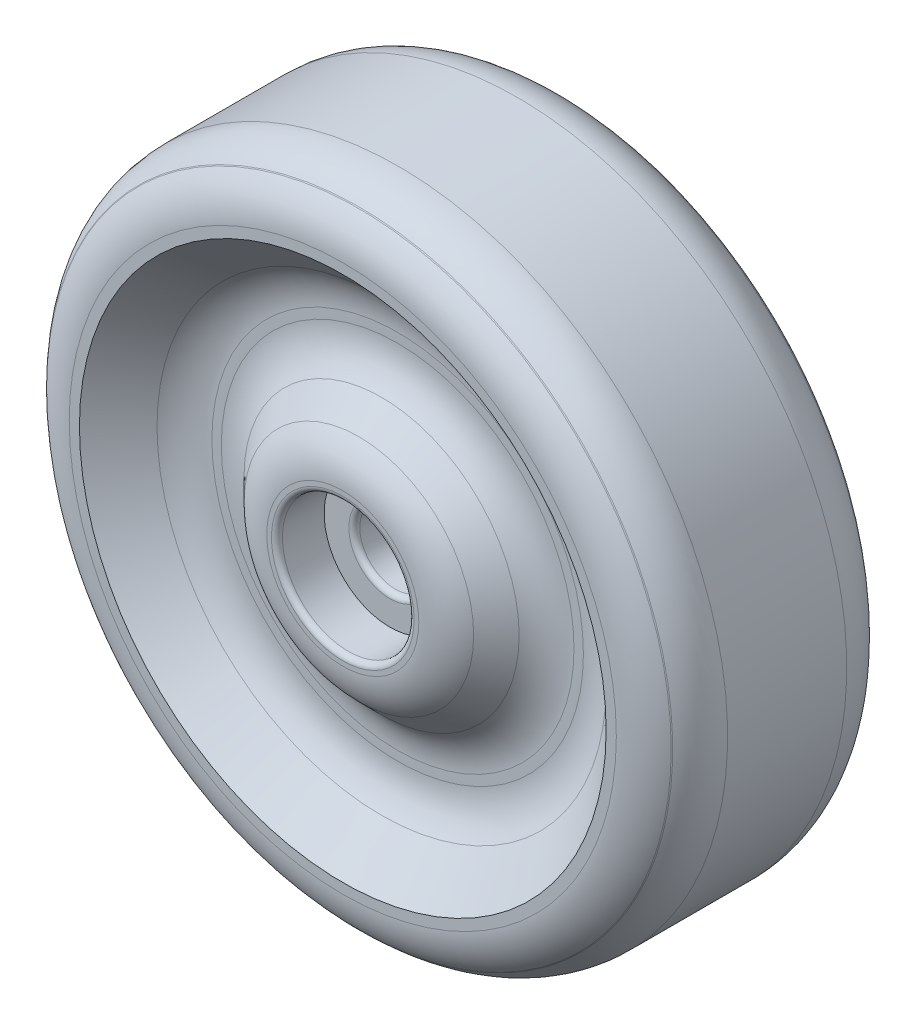
ISO-10303-21;
HEADER;
FILE_DESCRIPTION(('STEP AP214'),'2;1');
FILE_NAME('part.step','',(''),(''),'','','');
FILE_SCHEMA(('AUTOMOTIVE_DESIGN { 1 0 10303 214 1 1 1 1 }'));
ENDSEC;
DATA;
#1=APPLICATION_CONTEXT('core data for automotive mechanical design processes');
#2=APPLICATION_PROTOCOL_DEFINITION('international standard','automotive_design',2000,#1);
#3=PRODUCT_CONTEXT('',#1,'mechanical');
#4=PRODUCT('Part','Part','',(#3));
#5=PRODUCT_RELATED_PRODUCT_CATEGORY('part','',(#4));
#6=PRODUCT_DEFINITION_FORMATION('','',#4);
#7=PRODUCT_DEFINITION_CONTEXT('part definition',#1,'design');
#8=PRODUCT_DEFINITION('design','',#6,#7);
#9=PRODUCT_DEFINITION_SHAPE('','',#8);
#10=(LENGTH_UNIT() NAMED_UNIT(*) SI_UNIT(.MILLI.,.METRE.));
#11=(NAMED_UNIT(*) PLANE_ANGLE_UNIT() SI_UNIT($,.RADIAN.));
#12=(NAMED_UNIT(*) SI_UNIT($,.STERADIAN.) SOLID_ANGLE_UNIT());
#13=UNCERTAINTY_MEASURE_WITH_UNIT(LENGTH_MEASURE(1.E-05),#10,'distance_accuracy_value','');
#14=(GEOMETRIC_REPRESENTATION_CONTEXT(3) GLOBAL_UNCERTAINTY_ASSIGNED_CONTEXT((#13)) GLOBAL_UNIT_ASSIGNED_CONTEXT((#10,
#11,#12)) REPRESENTATION_CONTEXT('',''));
#15=CARTESIAN_POINT('',(0.,0.,0.));
#16=DIRECTION('',(0.,0.,1.));
#17=DIRECTION('',(1.,0.,0.));
#18=AXIS2_PLACEMENT_3D('',#15,#16,#17);
#19=CARTESIAN_POINT('',(0.,0.,-10.5));
#20=DIRECTION('',(0.,0.,1.));
#21=DIRECTION('',(1.,0.,0.));
#22=AXIS2_PLACEMENT_3D('',#19,#20,#21);
#23=PLANE('',#22);
#24=CARTESIAN_POINT('',(0.,0.,-10.5));
#25=DIRECTION('',(0.,0.,1.));
#26=DIRECTION('',(1.,0.,0.));
#27=AXIS2_PLACEMENT_3D('',#24,#25,#26);
#28=CIRCLE('',#27,6.92893218813451);
#29=CARTESIAN_POINT('',(6.92893218813451,0.,-10.5));
#30=VERTEX_POINT('',#29);
#31=EDGE_CURVE('E70',#30,#30,#28,.F.);
#32=ORIENTED_EDGE('',*,*,#31,.T.);
#33=EDGE_LOOP('',(#32));
#34=FACE_BOUND('',#33,.T.);
#35=CARTESIAN_POINT('',(0.,0.,-10.5));
#36=DIRECTION('',(0.,0.,1.));
#37=DIRECTION('',(1.,0.,0.));
#38=AXIS2_PLACEMENT_3D('',#35,#36,#37);
#39=CIRCLE('',#38,6.5);
#40=CARTESIAN_POINT('',(6.5,0.,-10.5));
#41=VERTEX_POINT('',#40);
#42=EDGE_CURVE('E97',#41,#41,#39,.T.);
#43=ORIENTED_EDGE('',*,*,#42,.T.);
#44=EDGE_LOOP('',(#43));
#45=FACE_BOUND('',#44,.T.);
#46=ADVANCED_FACE('F38',(#34,#45),#23,.F.);
#47=CARTESIAN_POINT('',(0.,0.,10.5));
#48=DIRECTION('',(0.,0.,1.));
#49=DIRECTION('',(1.,0.,0.));
#50=AXIS2_PLACEMENT_3D('',#47,#48,#49);
#51=PLANE('',#50);
#52=CARTESIAN_POINT('',(0.,0.,10.5));
#53=DIRECTION('',(0.,0.,1.));
#54=DIRECTION('',(1.,0.,0.));
#55=AXIS2_PLACEMENT_3D('',#52,#53,#54);
#56=CIRCLE('',#55,6.92893218813453);
#57=CARTESIAN_POINT('',(6.92893218813453,0.,10.5));
#58=VERTEX_POINT('',#57);
#59=EDGE_CURVE('E49',#58,#58,#56,.T.);
#60=ORIENTED_EDGE('',*,*,#59,.T.);
#61=EDGE_LOOP('',(#60));
#62=FACE_BOUND('',#61,.T.);
#63=CARTESIAN_POINT('',(0.,0.,10.5));
#64=DIRECTION('',(0.,0.,1.));
#65=DIRECTION('',(1.,0.,0.));
#66=AXIS2_PLACEMENT_3D('',#63,#64,#65);
#67=CIRCLE('',#66,6.5);
#68=CARTESIAN_POINT('',(6.5,0.,10.5));
#69=VERTEX_POINT('',#68);
#70=EDGE_CURVE('E85',#69,#69,#67,.F.);
#71=ORIENTED_EDGE('',*,*,#70,.T.);
#72=EDGE_LOOP('',(#71));
#73=FACE_BOUND('',#72,.T.);
#74=ADVANCED_FACE('F151',(#62,#73),#51,.T.);
#75=CARTESIAN_POINT('',(0.,0.,-10.5));
#76=DIRECTION('',(0.,0.,1.));
#77=DIRECTION('',(1.,0.,0.));
#78=AXIS2_PLACEMENT_3D('',#75,#76,#77);
#79=CYLINDRICAL_SURFACE('',#78,3.25);
#80=CARTESIAN_POINT('',(0.,0.,-5.7));
#81=DIRECTION('',(0.,0.,-1.));
#82=DIRECTION('',(-1.,0.,0.));
#83=AXIS2_PLACEMENT_3D('',#80,#81,#82);
#84=CIRCLE('',#83,3.25);
#85=CARTESIAN_POINT('',(3.25,0.,-5.7));
#86=VERTEX_POINT('',#85);
#87=EDGE_CURVE('E100',#86,#86,#84,.T.);
#88=CARTESIAN_POINT('',(0.,0.,5.7));
#89=DIRECTION('',(0.,0.,1.));
#90=DIRECTION('',(1.,0.,0.));
#91=AXIS2_PLACEMENT_3D('',#88,#89,#90);
#92=CIRCLE('',#91,3.25);
#93=CARTESIAN_POINT('',(3.25,0.,5.69999999999999));
#94=VERTEX_POINT('',#93);
#95=EDGE_CURVE('E103',#94,#94,#92,.T.);
#96=CARTESIAN_POINT('',(3.25,0.,-5.7));
#97=CARTESIAN_POINT('',(3.25,0.,-5.58125));
#98=CARTESIAN_POINT('',(3.25,0.,-5.4625));
#99=CARTESIAN_POINT('',(3.25,0.,-5.225));
#100=CARTESIAN_POINT('',(3.25,0.,-5.10625));
#101=CARTESIAN_POINT('',(3.25,0.,-4.86875));
#102=CARTESIAN_POINT('',(3.25,0.,-4.75));
#103=CARTESIAN_POINT('',(3.25,0.,-4.5125));
#104=CARTESIAN_POINT('',(3.25,0.,-4.39375));
#105=CARTESIAN_POINT('',(3.25,0.,-4.15625));
#106=CARTESIAN_POINT('',(3.25,0.,-4.0375));
#107=CARTESIAN_POINT('',(3.25,0.,-3.8));
#108=CARTESIAN_POINT('',(3.25,0.,-3.68125));
#109=CARTESIAN_POINT('',(3.25,0.,-3.44375));
#110=CARTESIAN_POINT('',(3.25,0.,-3.325));
#111=CARTESIAN_POINT('',(3.25,0.,-3.0875));
#112=CARTESIAN_POINT('',(3.25,0.,-2.96875));
#113=CARTESIAN_POINT('',(3.25,0.,-2.73125));
#114=CARTESIAN_POINT('',(3.25,0.,-2.6125));
#115=CARTESIAN_POINT('',(3.25,0.,-2.375));
#116=CARTESIAN_POINT('',(3.25,0.,-2.25625));
#117=CARTESIAN_POINT('',(3.25,0.,-2.01875));
#118=CARTESIAN_POINT('',(3.25,0.,-1.9));
#119=CARTESIAN_POINT('',(3.25,0.,-1.6625));
#120=CARTESIAN_POINT('',(3.25,0.,-1.54375));
#121=CARTESIAN_POINT('',(3.25,0.,-1.30625));
#122=CARTESIAN_POINT('',(3.25,0.,-1.1875));
#123=CARTESIAN_POINT('',(3.25,0.,-0.950000000000001));
#124=CARTESIAN_POINT('',(3.25,0.,-0.831250000000001));
#125=CARTESIAN_POINT('',(3.25,0.,-0.593750000000002));
#126=CARTESIAN_POINT('',(3.25,0.,-0.475000000000002));
#127=CARTESIAN_POINT('',(3.25,0.,-0.237500000000002));
#128=CARTESIAN_POINT('',(3.25,0.,-0.118750000000002));
#129=CARTESIAN_POINT('',(3.25,0.,0.118749999999998));
#130=CARTESIAN_POINT('',(3.25,0.,0.237499999999999));
#131=CARTESIAN_POINT('',(3.25,0.,0.474999999999999));
#132=CARTESIAN_POINT('',(3.25,0.,0.593749999999998));
#133=CARTESIAN_POINT('',(3.25,0.,0.831249999999997));
#134=CARTESIAN_POINT('',(3.25,0.,0.949999999999997));
#135=CARTESIAN_POINT('',(3.25,0.,1.1875));
#136=CARTESIAN_POINT('',(3.25,0.,1.30625));
#137=CARTESIAN_POINT('',(3.25,0.,1.54375));
#138=CARTESIAN_POINT('',(3.25,0.,1.6625));
#139=CARTESIAN_POINT('',(3.25,0.,1.9));
#140=CARTESIAN_POINT('',(3.25,0.,2.01875));
#141=CARTESIAN_POINT('',(3.25,0.,2.25625));
#142=CARTESIAN_POINT('',(3.25,0.,2.375));
#143=CARTESIAN_POINT('',(3.25,0.,2.6125));
#144=CARTESIAN_POINT('',(3.25,0.,2.73125));
#145=CARTESIAN_POINT('',(3.25,0.,2.96875));
#146=CARTESIAN_POINT('',(3.25,0.,3.0875));
#147=CARTESIAN_POINT('',(3.25,0.,3.325));
#148=CARTESIAN_POINT('',(3.25,0.,3.44375));
#149=CARTESIAN_POINT('',(3.25,0.,3.68125));
#150=CARTESIAN_POINT('',(3.25,0.,3.8));
#151=CARTESIAN_POINT('',(3.25,0.,4.0375));
#152=CARTESIAN_POINT('',(3.25,0.,4.15625));
#153=CARTESIAN_POINT('',(3.25,0.,4.39375));
#154=CARTESIAN_POINT('',(3.25,0.,4.5125));
#155=CARTESIAN_POINT('',(3.25,0.,4.75));
#156=CARTESIAN_POINT('',(3.25,0.,4.86875));
#157=CARTESIAN_POINT('',(3.25,0.,5.10625));
#158=CARTESIAN_POINT('',(3.25,0.,5.22499999999999));
#159=CARTESIAN_POINT('',(3.25,0.,5.46249999999999));
#160=CARTESIAN_POINT('',(3.25,0.,5.58124999999999));
#161=CARTESIAN_POINT('',(3.25,0.,5.69999999999999));
#162=B_SPLINE_CURVE_WITH_KNOTS('',3,(#96,#97,#98,#99,#100,#101,#102,#103,#104,#105,#106,#107,
#108,#109,#110,#111,#112,#113,#114,#115,#116,#117,#118,#119,#120,#121,#122,#123,#124,#125,#126,
#127,#128,#129,#130,#131,#132,#133,#134,#135,#136,#137,#138,#139,#140,#141,#142,#143,#144,#145,
#146,#147,#148,#149,#150,#151,#152,#153,#154,#155,#156,#157,#158,#159,#160,#161),.UNSPECIFIED.,
.F.,.F.,(4,2,2,2,2,2,2,2,2,2,2,2,2,2,2,2,2,2,2,2,2,2,2,2,2,2,2,2,2,2,2,2,4),(0.,0.35625,0.7125,
1.06875,1.425,1.78125,2.1375,2.49375,2.85,3.20625,3.5625,3.91875,4.275,4.63125,4.9875,5.34375,
5.7,6.05625,6.4125,6.76875,7.125,7.48125,7.8375,8.19375,8.55,8.90625,9.2625,9.61875,9.975,
10.33125,10.6875,11.04375,11.4),.UNSPECIFIED.);
#163=EDGE_CURVE('BSEAM177',#86,#94,#162,.T.);
#164=ORIENTED_EDGE('',*,*,#87,.T.);
#165=ORIENTED_EDGE('',*,*,#95,.T.);
#166=ORIENTED_EDGE('',*,*,#163,.T.);
#167=ORIENTED_EDGE('',*,*,#163,.F.);
#168=EDGE_LOOP('',(#164,#166,#165,#167));
#169=FACE_BOUND('',#168,.T.);
#170=ADVANCED_FACE('F177',(#169),#79,.F.);
#171=CARTESIAN_POINT('',(0.,0.,10.5));
#172=DIRECTION('',(0.,0.,-1.));
#173=DIRECTION('',(-1.,0.,0.));
#174=AXIS2_PLACEMENT_3D('',#171,#172,#173);
#175=CYLINDRICAL_SURFACE('',#174,30.);
#176=CARTESIAN_POINT('',(0.,0.,-5.42893218813449));
#177=DIRECTION('',(0.,0.,-1.));
#178=DIRECTION('',(-1.,0.,0.));
#179=AXIS2_PLACEMENT_3D('',#176,#177,#178);
#180=CIRCLE('',#179,30.);
#181=CARTESIAN_POINT('',(-30.,0.,-5.42893218813448));
#182=VERTEX_POINT('',#181);
#183=EDGE_CURVE('E118',#182,#182,#180,.F.);
#184=CARTESIAN_POINT('',(0.,0.,5.42893218813456));
#185=DIRECTION('',(0.,0.,1.));
#186=DIRECTION('',(1.,0.,0.));
#187=AXIS2_PLACEMENT_3D('',#184,#185,#186);
#188=CIRCLE('',#187,30.);
#189=CARTESIAN_POINT('',(-30.,0.,5.42893218813456));
#190=VERTEX_POINT('',#189);
#191=EDGE_CURVE('E121',#190,#190,#188,.F.);
#192=CARTESIAN_POINT('',(-30.,0.,-5.42893218813448));
#193=CARTESIAN_POINT('',(-30.,0.,-5.31582943421501));
#194=CARTESIAN_POINT('',(-30.,0.,-5.20272668029555));
#195=CARTESIAN_POINT('',(-30.,0.,-4.97652117245661));
#196=CARTESIAN_POINT('',(-30.,0.,-4.86341841853714));
#197=CARTESIAN_POINT('',(-30.,0.,-4.6372129106982));
#198=CARTESIAN_POINT('',(-30.,0.,-4.52411015677873));
#199=CARTESIAN_POINT('',(-30.,0.,-4.29790464893979));
#200=CARTESIAN_POINT('',(-30.,0.,-4.18480189502032));
#201=CARTESIAN_POINT('',(-30.,0.,-3.95859638718139));
#202=CARTESIAN_POINT('',(-30.,0.,-3.84549363326192));
#203=CARTESIAN_POINT('',(-30.,0.,-3.61928812542298));
#204=CARTESIAN_POINT('',(-30.,0.,-3.50618537150351));
#205=CARTESIAN_POINT('',(-30.,0.,-3.27997986366457));
#206=CARTESIAN_POINT('',(-30.,0.,-3.1668771097451));
#207=CARTESIAN_POINT('',(-30.,0.,-2.94067160190616));
#208=CARTESIAN_POINT('',(-30.,0.,-2.82756884798669));
#209=CARTESIAN_POINT('',(-30.,0.,-2.60136334014775));
#210=CARTESIAN_POINT('',(-30.,0.,-2.48826058622828));
#211=CARTESIAN_POINT('',(-30.,0.,-2.26205507838935));
#212=CARTESIAN_POINT('',(-30.,0.,-2.14895232446988));
#213=CARTESIAN_POINT('',(-30.,0.,-1.92274681663094));
#214=CARTESIAN_POINT('',(-30.,0.,-1.80964406271147));
#215=CARTESIAN_POINT('',(-30.,0.,-1.58343855487253));
#216=CARTESIAN_POINT('',(-30.,0.,-1.47033580095306));
#217=CARTESIAN_POINT('',(-30.,0.,-1.24413029311412));
#218=CARTESIAN_POINT('',(-30.,0.,-1.13102753919465));
#219=CARTESIAN_POINT('',(-30.,0.,-0.904822031355716));
#220=CARTESIAN_POINT('',(-30.,0.,-0.791719277436246));
#221=CARTESIAN_POINT('',(-30.,0.,-0.565513769597307));
#222=CARTESIAN_POINT('',(-30.,0.,-0.452411015677838));
#223=CARTESIAN_POINT('',(-30.,0.,-0.2262055078389));
#224=CARTESIAN_POINT('',(-30.,0.,-0.113102753919431));
#225=CARTESIAN_POINT('',(-30.,0.,0.113102753919507));
#226=CARTESIAN_POINT('',(-30.,0.,0.226205507838976));
#227=CARTESIAN_POINT('',(-30.,0.,0.452411015677914));
#228=CARTESIAN_POINT('',(-30.,0.,0.565513769597384));
#229=CARTESIAN_POINT('',(-30.,0.,0.791719277436323));
#230=CARTESIAN_POINT('',(-30.,0.,0.904822031355792));
#231=CARTESIAN_POINT('',(-30.,0.,1.13102753919473));
#232=CARTESIAN_POINT('',(-30.,0.,1.2441302931142));
#233=CARTESIAN_POINT('',(-30.,0.,1.47033580095314));
#234=CARTESIAN_POINT('',(-30.,0.,1.58343855487261));
#235=CARTESIAN_POINT('',(-30.,0.,1.80964406271155));
#236=CARTESIAN_POINT('',(-30.,0.,1.92274681663102));
#237=CARTESIAN_POINT('',(-30.,0.,2.14895232446995));
#238=CARTESIAN_POINT('',(-30.,0.,2.26205507838942));
#239=CARTESIAN_POINT('',(-30.,0.,2.48826058622836));
#240=CARTESIAN_POINT('',(-30.,0.,2.60136334014783));
#241=CARTESIAN_POINT('',(-30.,0.,2.82756884798677));
#242=CARTESIAN_POINT('',(-30.,0.,2.94067160190624));
#243=CARTESIAN_POINT('',(-30.,0.,3.16687710974518));
#244=CARTESIAN_POINT('',(-30.,0.,3.27997986366464));
#245=CARTESIAN_POINT('',(-30.,0.,3.50618537150358));
#246=CARTESIAN_POINT('',(-30.,0.,3.61928812542305));
#247=CARTESIAN_POINT('',(-30.,0.,3.84549363326199));
#248=CARTESIAN_POINT('',(-30.,0.,3.95859638718146));
#249=CARTESIAN_POINT('',(-30.,0.,4.1848018950204));
#250=CARTESIAN_POINT('',(-30.,0.,4.29790464893987));
#251=CARTESIAN_POINT('',(-30.,0.,4.52411015677881));
#252=CARTESIAN_POINT('',(-30.,0.,4.63721291069828));
#253=CARTESIAN_POINT('',(-30.,0.,4.86341841853721));
#254=CARTESIAN_POINT('',(-30.,0.,4.97652117245668));
#255=CARTESIAN_POINT('',(-30.,0.,5.20272668029562));
#256=CARTESIAN_POINT('',(-30.,0.,5.31582943421509));
#257=CARTESIAN_POINT('',(-30.,0.,5.42893218813456));
#258=B_SPLINE_CURVE_WITH_KNOTS('',3,(#192,#193,#194,#195,#196,#197,#198,#199,#200,#201,#202,
#203,#204,#205,#206,#207,#208,#209,#210,#211,#212,#213,#214,#215,#216,#217,#218,#219,#220,#221,
#222,#223,#224,#225,#226,#227,#228,#229,#230,#231,#232,#233,#234,#235,#236,#237,#238,#239,#240,
#241,#242,#243,#244,#245,#246,#247,#248,#249,#250,#251,#252,#253,#254,#255,#256,#257),
.UNSPECIFIED.,.F.,.F.,(4,2,2,2,2,2,2,2,2,2,2,2,2,2,2,2,2,2,2,2,2,2,2,2,2,2,2,2,2,2,2,2,4),(0.,
0.339308261758407,0.678616523516813,1.01792478527522,1.35723304703363,1.69654130879204,
2.03584957055044,2.37515783230885,2.71446609406726,3.05377435582567,3.39308261758407,
3.73239087934248,4.07169914110089,4.4110074028593,4.75031566461771,5.08962392637611,
5.42893218813452,5.76824044989293,6.10754871165134,6.44685697340974,6.78616523516815,
7.12547349692656,7.46478175868497,7.80409002044337,8.14339828220178,8.48270654396019,
8.8220148057186,9.161323067477,9.50063132923541,9.83993959099382,10.1792478527522,
10.5185561145106,10.857864376269),.UNSPECIFIED.);
#259=EDGE_CURVE('BSEAM149',#182,#190,#258,.T.);
#260=ORIENTED_EDGE('',*,*,#183,.T.);
#261=ORIENTED_EDGE('',*,*,#191,.T.);
#262=ORIENTED_EDGE('',*,*,#259,.T.);
#263=ORIENTED_EDGE('',*,*,#259,.F.);
#264=EDGE_LOOP('',(#260,#262,#261,#263));
#265=FACE_BOUND('',#264,.T.);
#266=ADVANCED_FACE('F149',(#265),#175,.T.);
#267=CARTESIAN_POINT('',(0.,0.,10.5));
#268=DIRECTION('',(0.,0.,1.));
#269=DIRECTION('',(1.,0.,0.));
#270=AXIS2_PLACEMENT_3D('',#267,#268,#269);
#271=CIRCLE('',#270,24.);
#272=CARTESIAN_POINT('',(24.,0.,10.5));
#273=VERTEX_POINT('',#272);
#274=EDGE_CURVE('E139',#273,#273,#271,.T.);
#275=ORIENTED_EDGE('',*,*,#274,.F.);
#276=EDGE_LOOP('',(#275));
#277=FACE_BOUND('',#276,.T.);
#278=CARTESIAN_POINT('',(0.,0.,10.5));
#279=DIRECTION('',(0.,0.,1.));
#280=DIRECTION('',(1.,0.,0.));
#281=AXIS2_PLACEMENT_3D('',#278,#279,#280);
#282=CIRCLE('',#281,24.9289321881346);
#283=CARTESIAN_POINT('',(24.9289321881346,0.,10.5));
#284=VERTEX_POINT('',#283);
#285=EDGE_CURVE('E115',#284,#284,#282,.T.);
#286=ORIENTED_EDGE('',*,*,#285,.T.);
#287=EDGE_LOOP('',(#286));
#288=FACE_BOUND('',#287,.T.);
#289=ADVANCED_FACE('F145',(#277,#288),#51,.T.);
#290=CARTESIAN_POINT('',(0.,0.,-7.49999999999997));
#291=DIRECTION('',(0.,0.,1.));
#292=DIRECTION('',(1.,0.,0.));
#293=AXIS2_PLACEMENT_3D('',#290,#291,#292);
#294=CONICAL_SURFACE('',#293,30.,0.785398163397452);
#295=CARTESIAN_POINT('',(0.,0.,-9.03553390593275));
#296=DIRECTION('',(0.,0.,1.));
#297=DIRECTION('',(1.,0.,0.));
#298=AXIS2_PLACEMENT_3D('',#295,#296,#297);
#299=CIRCLE('',#298,28.4644660940672);
#300=CARTESIAN_POINT('',(28.4644660940672,0.,-9.03553390593275));
#301=VERTEX_POINT('',#300);
#302=EDGE_CURVE('E124',#301,#301,#299,.T.);
#303=ORIENTED_EDGE('',*,*,#302,.T.);
#304=EDGE_LOOP('',(#303));
#305=FACE_BOUND('',#304,.T.);
#306=CARTESIAN_POINT('',(0.,0.,-8.96446609406723));
#307=DIRECTION('',(0.,0.,1.));
#308=DIRECTION('',(1.,0.,0.));
#309=AXIS2_PLACEMENT_3D('',#306,#307,#308);
#310=CIRCLE('',#309,28.5355339059327);
#311=CARTESIAN_POINT('',(28.5355339059327,0.,-8.96446609406723));
#312=VERTEX_POINT('',#311);
#313=EDGE_CURVE('E127',#312,#312,#310,.F.);
#314=ORIENTED_EDGE('',*,*,#313,.T.);
#315=EDGE_LOOP('',(#314));
#316=FACE_BOUND('',#315,.T.);
#317=ADVANCED_FACE('F148',(#305,#316),#294,.T.);
#318=CARTESIAN_POINT('',(0.,0.,10.5));
#319=DIRECTION('',(0.,0.,-1.));
#320=DIRECTION('',(-1.,0.,0.));
#321=AXIS2_PLACEMENT_3D('',#318,#319,#320);
#322=CONICAL_SURFACE('',#321,27.,0.785398163397445);
#323=CARTESIAN_POINT('',(0.,0.,9.03553390593273));
#324=DIRECTION('',(0.,0.,1.));
#325=DIRECTION('',(1.,0.,0.));
#326=AXIS2_PLACEMENT_3D('',#323,#324,#325);
#327=CIRCLE('',#326,28.4644660940673);
#328=CARTESIAN_POINT('',(-28.4644660940673,0.,9.03553390593273));
#329=VERTEX_POINT('',#328);
#330=EDGE_CURVE('E109',#329,#329,#327,.F.);
#331=CARTESIAN_POINT('',(0.,0.,8.96446609406729));
#332=DIRECTION('',(0.,0.,-1.));
#333=DIRECTION('',(-1.,0.,0.));
#334=AXIS2_PLACEMENT_3D('',#331,#332,#333);
#335=CIRCLE('',#334,28.5355339059328);
#336=CARTESIAN_POINT('',(-28.5355339059327,0.,8.96446609406729));
#337=VERTEX_POINT('',#336);
#338=EDGE_CURVE('E112',#337,#337,#335,.F.);
#339=CARTESIAN_POINT('',(-28.4644660940673,0.,9.03553390593273));
#340=CARTESIAN_POINT('',(-28.4652063837742,0.,9.03479361622579));
#341=CARTESIAN_POINT('',(-28.4659466734812,0.,9.03405332651886));
#342=CARTESIAN_POINT('',(-28.467427252895,0.,9.032572747105));
#343=CARTESIAN_POINT('',(-28.468167542602,0.,9.03183245739807));
#344=CARTESIAN_POINT('',(-28.4696481220158,0.,9.03035187798421));
#345=CARTESIAN_POINT('',(-28.4703884117228,0.,9.02961158827727));
#346=CARTESIAN_POINT('',(-28.4718689911366,0.,9.02813100886341));
#347=CARTESIAN_POINT('',(-28.4726092808436,0.,9.02739071915648));
#348=CARTESIAN_POINT('',(-28.4740898602574,0.,9.02591013974262));
#349=CARTESIAN_POINT('',(-28.4748301499644,0.,9.02516985003568));
#350=CARTESIAN_POINT('',(-28.4763107293782,0.,9.02368927062182));
#351=CARTESIAN_POINT('',(-28.4770510190851,0.,9.02294898091489));
#352=CARTESIAN_POINT('',(-28.478531598499,0.,9.02146840150102));
#353=CARTESIAN_POINT('',(-28.4792718882059,0.,9.02072811179409));
#354=CARTESIAN_POINT('',(-28.4807524676198,0.,9.01924753238023));
#355=CARTESIAN_POINT('',(-28.4814927573267,0.,9.0185072426733));
#356=CARTESIAN_POINT('',(-28.4829733367406,0.,9.01702666325943));
#357=CARTESIAN_POINT('',(-28.4837136264475,0.,9.0162863735525));
#358=CARTESIAN_POINT('',(-28.4851942058614,0.,9.01480579413864));
#359=CARTESIAN_POINT('',(-28.4859344955683,0.,9.01406550443171));
#360=CARTESIAN_POINT('',(-28.4874150749822,0.,9.01258492501784));
#361=CARTESIAN_POINT('',(-28.4881553646891,0.,9.01184463531091));
#362=CARTESIAN_POINT('',(-28.489635944103,0.,9.01036405589705));
#363=CARTESIAN_POINT('',(-28.4903762338099,0.,9.00962376619012));
#364=CARTESIAN_POINT('',(-28.4918568132238,0.,9.00814318677625));
#365=CARTESIAN_POINT('',(-28.4925971029307,0.,9.00740289706932));
#366=CARTESIAN_POINT('',(-28.4940776823446,0.,9.00592231765546));
#367=CARTESIAN_POINT('',(-28.4948179720515,0.,9.00518202794853));
#368=CARTESIAN_POINT('',(-28.4962985514654,0.,9.00370144853466));
#369=CARTESIAN_POINT('',(-28.4970388411723,0.,9.00296115882773));
#370=CARTESIAN_POINT('',(-28.4985194205862,0.,9.00148057941387));
#371=CARTESIAN_POINT('',(-28.4992597102931,0.,9.00074028970694));
#372=CARTESIAN_POINT('',(-28.500740289707,0.,8.99925971029307));
#373=CARTESIAN_POINT('',(-28.5014805794139,0.,8.99851942058614));
#374=CARTESIAN_POINT('',(-28.5029611588278,0.,8.99703884117228));
#375=CARTESIAN_POINT('',(-28.5037014485347,0.,8.99629855146535));
#376=CARTESIAN_POINT('',(-28.5051820279485,0.,8.99481797205148));
#377=CARTESIAN_POINT('',(-28.5059223176555,0.,8.99407768234455));
#378=CARTESIAN_POINT('',(-28.5074028970693,0.,8.99259710293069));
#379=CARTESIAN_POINT('',(-28.5081431867763,0.,8.99185681322376));
#380=CARTESIAN_POINT('',(-28.5096237661901,0.,8.9903762338099));
#381=CARTESIAN_POINT('',(-28.5103640558971,0.,8.98963594410296));
#382=CARTESIAN_POINT('',(-28.5118446353109,0.,8.9881553646891));
#383=CARTESIAN_POINT('',(-28.5125849250179,0.,8.98741507498217));
#384=CARTESIAN_POINT('',(-28.5140655044317,0.,8.98593449556831));
#385=CARTESIAN_POINT('',(-28.5148057941387,0.,8.98519420586137));
#386=CARTESIAN_POINT('',(-28.5162863735525,0.,8.98371362644751));
#387=CARTESIAN_POINT('',(-28.5170266632595,0.,8.98297333674058));
#388=CARTESIAN_POINT('',(-28.5185072426733,0.,8.98149275732672));
#389=CARTESIAN_POINT('',(-28.5192475323803,0.,8.98075246761978));
#390=CARTESIAN_POINT('',(-28.5207281117941,0.,8.97927188820592));
#391=CARTESIAN_POINT('',(-28.521468401501,0.,8.97853159849899));
#392=CARTESIAN_POINT('',(-28.5229489809149,0.,8.97705101908513));
#393=CARTESIAN_POINT('',(-28.5236892706218,0.,8.97631072937819));
#394=CARTESIAN_POINT('',(-28.5251698500357,0.,8.97483014996433));
#395=CARTESIAN_POINT('',(-28.5259101397426,0.,8.9740898602574));
#396=CARTESIAN_POINT('',(-28.5273907191565,0.,8.97260928084354));
#397=CARTESIAN_POINT('',(-28.5281310088634,0.,8.9718689911366));
#398=CARTESIAN_POINT('',(-28.5296115882773,0.,8.97038841172274));
#399=CARTESIAN_POINT('',(-28.5303518779842,0.,8.96964812201581));
#400=CARTESIAN_POINT('',(-28.5318324573981,0.,8.96816754260194));
#401=CARTESIAN_POINT('',(-28.532572747105,0.,8.96742725289501));
#402=CARTESIAN_POINT('',(-28.5340533265189,0.,8.96594667348115));
#403=CARTESIAN_POINT('',(-28.5347936162258,0.,8.96520638377422));
#404=CARTESIAN_POINT('',(-28.5355339059327,0.,8.96446609406729));
#405=B_SPLINE_CURVE_WITH_KNOTS('',3,(#339,#340,#341,#342,#343,#344,#345,#346,#347,#348,#349,
#350,#351,#352,#353,#354,#355,#356,#357,#358,#359,#360,#361,#362,#363,#364,#365,#366,#367,#368,
#369,#370,#371,#372,#373,#374,#375,#376,#377,#378,#379,#380,#381,#382,#383,#384,#385,#386,#387,
#388,#389,#390,#391,#392,#393,#394,#395,#396,#397,#398,#399,#400,#401,#402,#403,#404),
.UNSPECIFIED.,.F.,.F.,(4,2,2,2,2,2,2,2,2,2,2,2,2,2,2,2,2,2,2,2,2,2,2,2,2,2,2,2,2,2,2,2,4),(0.,
0.00314078323088285,0.00628156646176693,0.00942234969264977,0.0125631329235351,
0.0157039161544179,0.0188446993853032,0.0219854826161861,0.0251262658470714,0.0282670490779542,
0.0314078323088371,0.0345486155397212,0.037689398770604,0.0408301820014893,0.0439709652323722,
0.0471117484632575,0.0502525316941403,0.0533933149250256,0.0565340981559085,0.0596748813867913,
0.0628156646176766,0.0659564478485594,0.0690972310794435,0.0722380143103264,0.0753787975412117,
0.0785195807720945,0.0816603640029798,0.0848011472338627,0.0879419304647455,0.0910827136956308,
0.0942234969265137,0.0973642801573977,0.100505063388281),.UNSPECIFIED.);
#406=EDGE_CURVE('BSEAM191',#329,#337,#405,.T.);
#407=ORIENTED_EDGE('',*,*,#330,.T.);
#408=ORIENTED_EDGE('',*,*,#338,.T.);
#409=ORIENTED_EDGE('',*,*,#406,.T.);
#410=ORIENTED_EDGE('',*,*,#406,.F.);
#411=EDGE_LOOP('',(#407,#409,#408,#410));
#412=FACE_BOUND('',#411,.T.);
#413=ADVANCED_FACE('F191',(#412),#322,.T.);
#414=CARTESIAN_POINT('',(0.,0.,-5.5));
#415=DIRECTION('',(0.,0.,1.));
#416=DIRECTION('',(1.,0.,0.));
#417=AXIS2_PLACEMENT_3D('',#414,#415,#416);
#418=TOROIDAL_SURFACE('',#417,24.9289321881345,5.);
#419=ORIENTED_EDGE('',*,*,#302,.F.);
#420=EDGE_LOOP('',(#419));
#421=FACE_BOUND('',#420,.T.);
#422=CARTESIAN_POINT('',(0.,0.,-10.5));
#423=DIRECTION('',(0.,0.,1.));
#424=DIRECTION('',(1.,0.,0.));
#425=AXIS2_PLACEMENT_3D('',#422,#423,#424);
#426=CIRCLE('',#425,24.9289321881345);
#427=CARTESIAN_POINT('',(24.9289321881345,0.,-10.5));
#428=VERTEX_POINT('',#427);
#429=EDGE_CURVE('E130',#428,#428,#426,.F.);
#430=ORIENTED_EDGE('',*,*,#429,.F.);
#431=EDGE_LOOP('',(#430));
#432=FACE_BOUND('',#431,.T.);
#433=ADVANCED_FACE('F167',(#421,#432),#418,.T.);
#434=CARTESIAN_POINT('',(0.,0.,-5.42893218813448));
#435=DIRECTION('',(0.,0.,-1.));
#436=DIRECTION('',(-1.,0.,0.));
#437=AXIS2_PLACEMENT_3D('',#434,#435,#436);
#438=TOROIDAL_SURFACE('',#437,25.,5.);
#439=ORIENTED_EDGE('',*,*,#313,.F.);
#440=EDGE_LOOP('',(#439));
#441=FACE_BOUND('',#440,.T.);
#442=ORIENTED_EDGE('',*,*,#183,.F.);
#443=EDGE_LOOP('',(#442));
#444=FACE_BOUND('',#443,.T.);
#445=ADVANCED_FACE('F157',(#441,#444),#438,.T.);
#446=CARTESIAN_POINT('',(0.,0.,5.5));
#447=DIRECTION('',(0.,0.,1.));
#448=DIRECTION('',(1.,0.,0.));
#449=AXIS2_PLACEMENT_3D('',#446,#447,#448);
#450=TOROIDAL_SURFACE('',#449,24.9289321881346,5.);
#451=ORIENTED_EDGE('',*,*,#330,.F.);
#452=EDGE_LOOP('',(#451));
#453=FACE_BOUND('',#452,.T.);
#454=ORIENTED_EDGE('',*,*,#285,.F.);
#455=EDGE_LOOP('',(#454));
#456=FACE_BOUND('',#455,.T.);
#457=ADVANCED_FACE('F154',(#453,#456),#450,.T.);
#458=CARTESIAN_POINT('',(0.,0.,5.42893218813456));
#459=DIRECTION('',(0.,0.,1.));
#460=DIRECTION('',(1.,0.,0.));
#461=AXIS2_PLACEMENT_3D('',#458,#459,#460);
#462=TOROIDAL_SURFACE('',#461,25.,5.);
#463=ORIENTED_EDGE('',*,*,#338,.F.);
#464=EDGE_LOOP('',(#463));
#465=FACE_BOUND('',#464,.T.);
#466=ORIENTED_EDGE('',*,*,#191,.F.);
#467=EDGE_LOOP('',(#466));
#468=FACE_BOUND('',#467,.T.);
#469=ADVANCED_FACE('F156',(#465,#468),#462,.T.);
#470=CARTESIAN_POINT('',(0.,0.,6.2));
#471=DIRECTION('',(0.,0.,1.));
#472=DIRECTION('',(1.,0.,0.));
#473=AXIS2_PLACEMENT_3D('',#470,#471,#472);
#474=PLANE('',#473);
#475=CARTESIAN_POINT('',(0.,0.,6.2));
#476=DIRECTION('',(0.,0.,1.));
#477=DIRECTION('',(1.,0.,0.));
#478=AXIS2_PLACEMENT_3D('',#475,#476,#477);
#479=CIRCLE('',#478,3.75);
#480=CARTESIAN_POINT('',(3.75,0.,6.2));
#481=VERTEX_POINT('',#480);
#482=EDGE_CURVE('E91',#481,#481,#479,.F.);
#483=ORIENTED_EDGE('',*,*,#482,.T.);
#484=EDGE_LOOP('',(#483));
#485=FACE_BOUND('',#484,.T.);
#486=CARTESIAN_POINT('',(0.,0.,6.2));
#487=DIRECTION('',(0.,0.,1.));
#488=DIRECTION('',(1.,0.,0.));
#489=AXIS2_PLACEMENT_3D('',#486,#487,#488);
#490=CIRCLE('',#489,6.);
#491=CARTESIAN_POINT('',(6.,0.,6.2));
#492=VERTEX_POINT('',#491);
#493=EDGE_CURVE('E133',#492,#492,#490,.T.);
#494=ORIENTED_EDGE('',*,*,#493,.T.);
#495=EDGE_LOOP('',(#494));
#496=FACE_BOUND('',#495,.T.);
#497=ADVANCED_FACE('F164',(#485,#496),#474,.T.);
#498=CARTESIAN_POINT('',(0.,0.,6.2));
#499=DIRECTION('',(0.,0.,1.));
#500=DIRECTION('',(1.,0.,0.));
#501=AXIS2_PLACEMENT_3D('',#498,#499,#500);
#502=CYLINDRICAL_SURFACE('',#501,6.);
#503=CARTESIAN_POINT('',(0.,0.,10.));
#504=DIRECTION('',(0.,0.,1.));
#505=DIRECTION('',(1.,0.,0.));
#506=AXIS2_PLACEMENT_3D('',#503,#504,#505);
#507=CIRCLE('',#506,6.);
#508=CARTESIAN_POINT('',(6.,0.,10.));
#509=VERTEX_POINT('',#508);
#510=EDGE_CURVE('E88',#509,#509,#507,.T.);
#511=CARTESIAN_POINT('',(6.,0.,10.));
#512=CARTESIAN_POINT('',(6.,0.,9.96041666666667));
#513=CARTESIAN_POINT('',(6.,0.,9.92083333333333));
#514=CARTESIAN_POINT('',(6.,0.,9.84166666666667));
#515=CARTESIAN_POINT('',(6.,0.,9.80208333333333));
#516=CARTESIAN_POINT('',(6.,0.,9.72291666666667));
#517=CARTESIAN_POINT('',(6.,0.,9.68333333333333));
#518=CARTESIAN_POINT('',(6.,0.,9.60416666666667));
#519=CARTESIAN_POINT('',(6.,0.,9.56458333333333));
#520=CARTESIAN_POINT('',(6.,0.,9.48541666666667));
#521=CARTESIAN_POINT('',(6.,0.,9.44583333333333));
#522=CARTESIAN_POINT('',(6.,0.,9.36666666666667));
#523=CARTESIAN_POINT('',(6.,0.,9.32708333333333));
#524=CARTESIAN_POINT('',(6.,0.,9.24791666666667));
#525=CARTESIAN_POINT('',(6.,0.,9.20833333333333));
#526=CARTESIAN_POINT('',(6.,0.,9.12916666666667));
#527=CARTESIAN_POINT('',(6.,0.,9.08958333333333));
#528=CARTESIAN_POINT('',(6.,0.,9.01041666666667));
#529=CARTESIAN_POINT('',(6.,0.,8.97083333333333));
#530=CARTESIAN_POINT('',(6.,0.,8.89166666666667));
#531=CARTESIAN_POINT('',(6.,0.,8.85208333333333));
#532=CARTESIAN_POINT('',(6.,0.,8.77291666666667));
#533=CARTESIAN_POINT('',(6.,0.,8.73333333333333));
#534=CARTESIAN_POINT('',(6.,0.,8.65416666666667));
#535=CARTESIAN_POINT('',(6.,0.,8.61458333333333));
#536=CARTESIAN_POINT('',(6.,0.,8.53541666666667));
#537=CARTESIAN_POINT('',(6.,0.,8.49583333333333));
#538=CARTESIAN_POINT('',(6.,0.,8.41666666666667));
#539=CARTESIAN_POINT('',(6.,0.,8.37708333333333));
#540=CARTESIAN_POINT('',(6.,0.,8.29791666666667));
#541=CARTESIAN_POINT('',(6.,0.,8.25833333333333));
#542=CARTESIAN_POINT('',(6.,0.,8.17916666666667));
#543=CARTESIAN_POINT('',(6.,0.,8.13958333333333));
#544=CARTESIAN_POINT('',(6.,0.,8.06041666666667));
#545=CARTESIAN_POINT('',(6.,0.,8.02083333333333));
#546=CARTESIAN_POINT('',(6.,0.,7.94166666666667));
#547=CARTESIAN_POINT('',(6.,0.,7.90208333333333));
#548=CARTESIAN_POINT('',(6.,0.,7.82291666666667));
#549=CARTESIAN_POINT('',(6.,0.,7.78333333333333));
#550=CARTESIAN_POINT('',(6.,0.,7.70416666666667));
#551=CARTESIAN_POINT('',(6.,0.,7.66458333333333));
#552=CARTESIAN_POINT('',(6.,0.,7.58541666666667));
#553=CARTESIAN_POINT('',(6.,0.,7.54583333333333));
#554=CARTESIAN_POINT('',(6.,0.,7.46666666666667));
#555=CARTESIAN_POINT('',(6.,0.,7.42708333333333));
#556=CARTESIAN_POINT('',(6.,0.,7.34791666666667));
#557=CARTESIAN_POINT('',(6.,0.,7.30833333333333));
#558=CARTESIAN_POINT('',(6.,0.,7.22916666666667));
#559=CARTESIAN_POINT('',(6.,0.,7.18958333333333));
#560=CARTESIAN_POINT('',(6.,0.,7.11041666666667));
#561=CARTESIAN_POINT('',(6.,0.,7.07083333333333));
#562=CARTESIAN_POINT('',(6.,0.,6.99166666666667));
#563=CARTESIAN_POINT('',(6.,0.,6.95208333333333));
#564=CARTESIAN_POINT('',(6.,0.,6.87291666666667));
#565=CARTESIAN_POINT('',(6.,0.,6.83333333333333));
#566=CARTESIAN_POINT('',(6.,0.,6.75416666666667));
#567=CARTESIAN_POINT('',(6.,0.,6.71458333333333));
#568=CARTESIAN_POINT('',(6.,0.,6.63541666666667));
#569=CARTESIAN_POINT('',(6.,0.,6.59583333333333));
#570=CARTESIAN_POINT('',(6.,0.,6.51666666666667));
#571=CARTESIAN_POINT('',(6.,0.,6.47708333333333));
#572=CARTESIAN_POINT('',(6.,0.,6.39791666666667));
#573=CARTESIAN_POINT('',(6.,0.,6.35833333333333));
#574=CARTESIAN_POINT('',(6.,0.,6.27916666666667));
#575=CARTESIAN_POINT('',(6.,0.,6.23958333333333));
#576=CARTESIAN_POINT('',(6.,0.,6.2));
#577=B_SPLINE_CURVE_WITH_KNOTS('',3,(#511,#512,#513,#514,#515,#516,#517,#518,#519,#520,#521,
#522,#523,#524,#525,#526,#527,#528,#529,#530,#531,#532,#533,#534,#535,#536,#537,#538,#539,#540,
#541,#542,#543,#544,#545,#546,#547,#548,#549,#550,#551,#552,#553,#554,#555,#556,#557,#558,#559,
#560,#561,#562,#563,#564,#565,#566,#567,#568,#569,#570,#571,#572,#573,#574,#575,#576),
.UNSPECIFIED.,.F.,.F.,(4,2,2,2,2,2,2,2,2,2,2,2,2,2,2,2,2,2,2,2,2,2,2,2,2,2,2,2,2,2,2,2,4),(0.,
0.118750000000001,0.2375,0.356250000000001,0.475000000000001,0.593750000000001,0.7125,0.83125,
0.950000000000001,1.06875,1.1875,1.30625,1.425,1.54375,1.6625,1.78125,1.9,2.01875,2.1375,
2.25625,2.375,2.49375,2.6125,2.73125,2.85,2.96875,3.0875,3.20625,3.325,3.44375,3.5625,3.68125,
3.8),.UNSPECIFIED.);
#578=EDGE_CURVE('BSEAM255',#509,#492,#577,.T.);
#579=ORIENTED_EDGE('',*,*,#510,.T.);
#580=ORIENTED_EDGE('',*,*,#493,.F.);
#581=ORIENTED_EDGE('',*,*,#578,.T.);
#582=ORIENTED_EDGE('',*,*,#578,.F.);
#583=EDGE_LOOP('',(#579,#581,#580,#582));
#584=FACE_BOUND('',#583,.T.);
#585=ADVANCED_FACE('F255',(#584),#502,.F.);
#586=CARTESIAN_POINT('',(0.,0.,-6.2));
#587=DIRECTION('',(0.,0.,-1.));
#588=DIRECTION('',(1.,0.,0.));
#589=AXIS2_PLACEMENT_3D('',#586,#587,#588);
#590=PLANE('',#589);
#591=CARTESIAN_POINT('',(0.,0.,-6.2));
#592=DIRECTION('',(0.,0.,-1.));
#593=DIRECTION('',(-1.,0.,0.));
#594=AXIS2_PLACEMENT_3D('',#591,#592,#593);
#595=CIRCLE('',#594,3.75);
#596=CARTESIAN_POINT('',(-3.75,0.,-6.2));
#597=VERTEX_POINT('',#596);
#598=EDGE_CURVE('E106',#597,#597,#595,.F.);
#599=ORIENTED_EDGE('',*,*,#598,.T.);
#600=EDGE_LOOP('',(#599));
#601=FACE_BOUND('',#600,.T.);
#602=CARTESIAN_POINT('',(0.,0.,-6.2));
#603=DIRECTION('',(0.,0.,1.));
#604=DIRECTION('',(1.,0.,0.));
#605=AXIS2_PLACEMENT_3D('',#602,#603,#604);
#606=CIRCLE('',#605,6.);
#607=CARTESIAN_POINT('',(-6.,0.,-6.2));
#608=VERTEX_POINT('',#607);
#609=EDGE_CURVE('E136',#608,#608,#606,.T.);
#610=ORIENTED_EDGE('',*,*,#609,.F.);
#611=EDGE_LOOP('',(#610));
#612=FACE_BOUND('',#611,.T.);
#613=ADVANCED_FACE('F258',(#601,#612),#590,.T.);
#614=CARTESIAN_POINT('',(0.,0.,-6.2));
#615=DIRECTION('',(0.,0.,-1.));
#616=DIRECTION('',(-1.,0.,0.));
#617=AXIS2_PLACEMENT_3D('',#614,#615,#616);
#618=CYLINDRICAL_SURFACE('',#617,6.);
#619=CARTESIAN_POINT('',(0.,0.,-10.));
#620=DIRECTION('',(0.,0.,1.));
#621=DIRECTION('',(1.,0.,0.));
#622=AXIS2_PLACEMENT_3D('',#619,#620,#621);
#623=CIRCLE('',#622,6.);
#624=CARTESIAN_POINT('',(-6.,0.,-10.));
#625=VERTEX_POINT('',#624);
#626=EDGE_CURVE('E94',#625,#625,#623,.F.);
#627=CARTESIAN_POINT('',(-6.,0.,-10.));
#628=CARTESIAN_POINT('',(-6.,0.,-9.96041666666667));
#629=CARTESIAN_POINT('',(-6.,0.,-9.92083333333333));
#630=CARTESIAN_POINT('',(-6.,0.,-9.84166666666667));
#631=CARTESIAN_POINT('',(-6.,0.,-9.80208333333333));
#632=CARTESIAN_POINT('',(-6.,0.,-9.72291666666667));
#633=CARTESIAN_POINT('',(-6.,0.,-9.68333333333333));
#634=CARTESIAN_POINT('',(-6.,0.,-9.60416666666667));
#635=CARTESIAN_POINT('',(-6.,0.,-9.56458333333333));
#636=CARTESIAN_POINT('',(-6.,0.,-9.48541666666667));
#637=CARTESIAN_POINT('',(-6.,0.,-9.44583333333333));
#638=CARTESIAN_POINT('',(-6.,0.,-9.36666666666667));
#639=CARTESIAN_POINT('',(-6.,0.,-9.32708333333333));
#640=CARTESIAN_POINT('',(-6.,0.,-9.24791666666667));
#641=CARTESIAN_POINT('',(-6.,0.,-9.20833333333333));
#642=CARTESIAN_POINT('',(-6.,0.,-9.12916666666667));
#643=CARTESIAN_POINT('',(-6.,0.,-9.08958333333333));
#644=CARTESIAN_POINT('',(-6.,0.,-9.01041666666667));
#645=CARTESIAN_POINT('',(-6.,0.,-8.97083333333333));
#646=CARTESIAN_POINT('',(-6.,0.,-8.89166666666667));
#647=CARTESIAN_POINT('',(-6.,0.,-8.85208333333333));
#648=CARTESIAN_POINT('',(-6.,0.,-8.77291666666667));
#649=CARTESIAN_POINT('',(-6.,0.,-8.73333333333333));
#650=CARTESIAN_POINT('',(-6.,0.,-8.65416666666667));
#651=CARTESIAN_POINT('',(-6.,0.,-8.61458333333333));
#652=CARTESIAN_POINT('',(-6.,0.,-8.53541666666667));
#653=CARTESIAN_POINT('',(-6.,0.,-8.49583333333333));
#654=CARTESIAN_POINT('',(-6.,0.,-8.41666666666667));
#655=CARTESIAN_POINT('',(-6.,0.,-8.37708333333333));
#656=CARTESIAN_POINT('',(-6.,0.,-8.29791666666667));
#657=CARTESIAN_POINT('',(-6.,0.,-8.25833333333333));
#658=CARTESIAN_POINT('',(-6.,0.,-8.17916666666667));
#659=CARTESIAN_POINT('',(-6.,0.,-8.13958333333333));
#660=CARTESIAN_POINT('',(-6.,0.,-8.06041666666667));
#661=CARTESIAN_POINT('',(-6.,0.,-8.02083333333333));
#662=CARTESIAN_POINT('',(-6.,0.,-7.94166666666667));
#663=CARTESIAN_POINT('',(-6.,0.,-7.90208333333333));
#664=CARTESIAN_POINT('',(-6.,0.,-7.82291666666667));
#665=CARTESIAN_POINT('',(-6.,0.,-7.78333333333333));
#666=CARTESIAN_POINT('',(-6.,0.,-7.70416666666667));
#667=CARTESIAN_POINT('',(-6.,0.,-7.66458333333333));
#668=CARTESIAN_POINT('',(-6.,0.,-7.58541666666667));
#669=CARTESIAN_POINT('',(-6.,0.,-7.54583333333333));
#670=CARTESIAN_POINT('',(-6.,0.,-7.46666666666667));
#671=CARTESIAN_POINT('',(-6.,0.,-7.42708333333333));
#672=CARTESIAN_POINT('',(-6.,0.,-7.34791666666667));
#673=CARTESIAN_POINT('',(-6.,0.,-7.30833333333333));
#674=CARTESIAN_POINT('',(-6.,0.,-7.22916666666667));
#675=CARTESIAN_POINT('',(-6.,0.,-7.18958333333333));
#676=CARTESIAN_POINT('',(-6.,0.,-7.11041666666667));
#677=CARTESIAN_POINT('',(-6.,0.,-7.07083333333333));
#678=CARTESIAN_POINT('',(-6.,0.,-6.99166666666667));
#679=CARTESIAN_POINT('',(-6.,0.,-6.95208333333333));
#680=CARTESIAN_POINT('',(-6.,0.,-6.87291666666667));
#681=CARTESIAN_POINT('',(-6.,0.,-6.83333333333333));
#682=CARTESIAN_POINT('',(-6.,0.,-6.75416666666667));
#683=CARTESIAN_POINT('',(-6.,0.,-6.71458333333333));
#684=CARTESIAN_POINT('',(-6.,0.,-6.63541666666667));
#685=CARTESIAN_POINT('',(-6.,0.,-6.59583333333333));
#686=CARTESIAN_POINT('',(-6.,0.,-6.51666666666667));
#687=CARTESIAN_POINT('',(-6.,0.,-6.47708333333333));
#688=CARTESIAN_POINT('',(-6.,0.,-6.39791666666667));
#689=CARTESIAN_POINT('',(-6.,0.,-6.35833333333333));
#690=CARTESIAN_POINT('',(-6.,0.,-6.27916666666667));
#691=CARTESIAN_POINT('',(-6.,0.,-6.23958333333333));
#692=CARTESIAN_POINT('',(-6.,0.,-6.2));
#693=B_SPLINE_CURVE_WITH_KNOTS('',3,(#627,#628,#629,#630,#631,#632,#633,#634,#635,#636,#637,
#638,#639,#640,#641,#642,#643,#644,#645,#646,#647,#648,#649,#650,#651,#652,#653,#654,#655,#656,
#657,#658,#659,#660,#661,#662,#663,#664,#665,#666,#667,#668,#669,#670,#671,#672,#673,#674,#675,
#676,#677,#678,#679,#680,#681,#682,#683,#684,#685,#686,#687,#688,#689,#690,#691,#692),
.UNSPECIFIED.,.F.,.F.,(4,2,2,2,2,2,2,2,2,2,2,2,2,2,2,2,2,2,2,2,2,2,2,2,2,2,2,2,2,2,2,2,4),(0.,
0.118749999999999,0.2375,0.356249999999999,0.475,0.593749999999999,0.7125,0.83125,0.95,1.06875,
1.1875,1.30625,1.425,1.54375,1.6625,1.78125,1.9,2.01875,2.1375,2.25625,2.375,2.49375,2.6125,
2.73125,2.85,2.96875,3.0875,3.20625,3.325,3.44375,3.5625,3.68125,3.8),.UNSPECIFIED.);
#694=EDGE_CURVE('BSEAM268',#625,#608,#693,.T.);
#695=ORIENTED_EDGE('',*,*,#626,.T.);
#696=ORIENTED_EDGE('',*,*,#609,.T.);
#697=ORIENTED_EDGE('',*,*,#694,.T.);
#698=ORIENTED_EDGE('',*,*,#694,.F.);
#699=EDGE_LOOP('',(#695,#697,#696,#698));
#700=FACE_BOUND('',#699,.T.);
#701=ADVANCED_FACE('F268',(#700),#618,.F.);
#702=CARTESIAN_POINT('',(0.,0.,-5.7));
#703=DIRECTION('',(0.,0.,-1.));
#704=DIRECTION('',(-1.,0.,0.));
#705=AXIS2_PLACEMENT_3D('',#702,#703,#704);
#706=TOROIDAL_SURFACE('',#705,3.75,0.5);
#707=ORIENTED_EDGE('',*,*,#87,.F.);
#708=EDGE_LOOP('',(#707));
#709=FACE_BOUND('',#708,.T.);
#710=ORIENTED_EDGE('',*,*,#598,.F.);
#711=EDGE_LOOP('',(#710));
#712=FACE_BOUND('',#711,.T.);
#713=ADVANCED_FACE('F286',(#709,#712),#706,.T.);
#714=CARTESIAN_POINT('',(0.,0.,-10.));
#715=DIRECTION('',(0.,0.,1.));
#716=DIRECTION('',(1.,0.,0.));
#717=AXIS2_PLACEMENT_3D('',#714,#715,#716);
#718=TOROIDAL_SURFACE('',#717,6.5,0.5);
#719=ORIENTED_EDGE('',*,*,#626,.F.);
#720=EDGE_LOOP('',(#719));
#721=FACE_BOUND('',#720,.T.);
#722=ORIENTED_EDGE('',*,*,#42,.F.);
#723=EDGE_LOOP('',(#722));
#724=FACE_BOUND('',#723,.T.);
#725=ADVANCED_FACE('F280',(#721,#724),#718,.T.);
#726=CARTESIAN_POINT('',(0.,0.,5.7));
#727=DIRECTION('',(0.,0.,1.));
#728=DIRECTION('',(1.,0.,0.));
#729=AXIS2_PLACEMENT_3D('',#726,#727,#728);
#730=TOROIDAL_SURFACE('',#729,3.75,0.5);
#731=ORIENTED_EDGE('',*,*,#95,.F.);
#732=EDGE_LOOP('',(#731));
#733=FACE_BOUND('',#732,.T.);
#734=ORIENTED_EDGE('',*,*,#482,.F.);
#735=EDGE_LOOP('',(#734));
#736=FACE_BOUND('',#735,.T.);
#737=ADVANCED_FACE('F251',(#733,#736),#730,.T.);
#738=CARTESIAN_POINT('',(0.,0.,10.));
#739=DIRECTION('',(0.,0.,1.));
#740=DIRECTION('',(1.,0.,0.));
#741=AXIS2_PLACEMENT_3D('',#738,#739,#740);
#742=TOROIDAL_SURFACE('',#741,6.5,0.5);
#743=ORIENTED_EDGE('',*,*,#70,.F.);
#744=EDGE_LOOP('',(#743));
#745=FACE_BOUND('',#744,.T.);
#746=ORIENTED_EDGE('',*,*,#510,.F.);
#747=EDGE_LOOP('',(#746));
#748=FACE_BOUND('',#747,.T.);
#749=ADVANCED_FACE('F247',(#745,#748),#742,.T.);
#750=CARTESIAN_POINT('',(0.,0.,5.5));
#751=DIRECTION('',(0.,0.,1.));
#752=DIRECTION('',(1.,0.,0.));
#753=AXIS2_PLACEMENT_3D('',#750,#751,#752);
#754=PLANE('',#753);
#755=CARTESIAN_POINT('',(0.,0.,5.5));
#756=DIRECTION('',(0.,0.,1.));
#757=DIRECTION('',(1.,0.,0.));
#758=AXIS2_PLACEMENT_3D('',#755,#756,#757);
#759=CIRCLE('',#758,16.9289321881345);
#760=CARTESIAN_POINT('',(16.9289321881345,0.,5.5));
#761=VERTEX_POINT('',#760);
#762=EDGE_CURVE('E58',#761,#761,#759,.T.);
#763=ORIENTED_EDGE('',*,*,#762,.T.);
#764=EDGE_LOOP('',(#763));
#765=FACE_BOUND('',#764,.T.);
#766=CARTESIAN_POINT('',(0.,0.,5.5));
#767=DIRECTION('',(0.,0.,1.));
#768=DIRECTION('',(1.,0.,0.));
#769=AXIS2_PLACEMENT_3D('',#766,#767,#768);
#770=CIRCLE('',#769,16.0710678118655);
#771=CARTESIAN_POINT('',(16.0710678118655,0.,5.5));
#772=VERTEX_POINT('',#771);
#773=EDGE_CURVE('E61',#772,#772,#770,.F.);
#774=ORIENTED_EDGE('',*,*,#773,.T.);
#775=EDGE_LOOP('',(#774));
#776=FACE_BOUND('',#775,.T.);
#777=ADVANCED_FACE('F250',(#765,#776),#754,.T.);
#778=CARTESIAN_POINT('',(0.,0.,-5.5));
#779=DIRECTION('',(0.,0.,-1.));
#780=DIRECTION('',(1.,0.,0.));
#781=AXIS2_PLACEMENT_3D('',#778,#779,#780);
#782=PLANE('',#781);
#783=CARTESIAN_POINT('',(0.,0.,-5.5));
#784=DIRECTION('',(0.,0.,-1.));
#785=DIRECTION('',(-1.,0.,0.));
#786=AXIS2_PLACEMENT_3D('',#783,#784,#785);
#787=CIRCLE('',#786,16.0710678118655);
#788=CARTESIAN_POINT('',(-16.0710678118655,0.,-5.5));
#789=VERTEX_POINT('',#788);
#790=EDGE_CURVE('E64',#789,#789,#787,.F.);
#791=ORIENTED_EDGE('',*,*,#790,.T.);
#792=EDGE_LOOP('',(#791));
#793=FACE_BOUND('',#792,.T.);
#794=CARTESIAN_POINT('',(0.,0.,-5.5));
#795=DIRECTION('',(0.,0.,-1.));
#796=DIRECTION('',(-1.,0.,0.));
#797=AXIS2_PLACEMENT_3D('',#794,#795,#796);
#798=CIRCLE('',#797,16.9289321881345);
#799=CARTESIAN_POINT('',(-16.9289321881345,0.,-5.5));
#800=VERTEX_POINT('',#799);
#801=EDGE_CURVE('E67',#800,#800,#798,.T.);
#802=ORIENTED_EDGE('',*,*,#801,.T.);
#803=EDGE_LOOP('',(#802));
#804=FACE_BOUND('',#803,.T.);
#805=ADVANCED_FACE('F298',(#793,#804),#782,.T.);
#806=CARTESIAN_POINT('',(0.,0.,-5.5));
#807=DIRECTION('',(0.,0.,1.));
#808=DIRECTION('',(1.,0.,0.));
#809=AXIS2_PLACEMENT_3D('',#806,#807,#808);
#810=CONICAL_SURFACE('',#809,14.,0.785398163397454);
#811=CARTESIAN_POINT('',(0.,0.,-9.03553390593276));
#812=DIRECTION('',(0.,0.,-1.));
#813=DIRECTION('',(-1.,0.,0.));
#814=AXIS2_PLACEMENT_3D('',#811,#812,#813);
#815=CIRCLE('',#814,10.4644660940672);
#816=CARTESIAN_POINT('',(-10.4644660940672,0.,-9.03553390593276));
#817=VERTEX_POINT('',#816);
#818=EDGE_CURVE('E73',#817,#817,#815,.F.);
#819=ORIENTED_EDGE('',*,*,#818,.T.);
#820=EDGE_LOOP('',(#819));
#821=FACE_BOUND('',#820,.T.);
#822=CARTESIAN_POINT('',(0.,0.,-6.96446609406725));
#823=DIRECTION('',(0.,0.,-1.));
#824=DIRECTION('',(-1.,0.,0.));
#825=AXIS2_PLACEMENT_3D('',#822,#823,#824);
#826=CIRCLE('',#825,12.5355339059328);
#827=CARTESIAN_POINT('',(-12.5355339059328,0.,-6.96446609406725));
#828=VERTEX_POINT('',#827);
#829=EDGE_CURVE('E76',#828,#828,#826,.T.);
#830=ORIENTED_EDGE('',*,*,#829,.T.);
#831=EDGE_LOOP('',(#830));
#832=FACE_BOUND('',#831,.T.);
#833=ADVANCED_FACE('F291',(#821,#832),#810,.T.);
#834=CARTESIAN_POINT('',(0.,0.,-10.5));
#835=DIRECTION('',(0.,0.,-1.));
#836=DIRECTION('',(-1.,0.,0.));
#837=AXIS2_PLACEMENT_3D('',#834,#835,#836);
#838=CONICAL_SURFACE('',#837,24.,0.785398163397443);
#839=CARTESIAN_POINT('',(0.,0.,-9.21274051769299));
#840=DIRECTION('',(0.,0.,1.));
#841=DIRECTION('',(1.,0.,0.));
#842=AXIS2_PLACEMENT_3D('',#839,#840,#841);
#843=CIRCLE('',#842,22.712740517693);
#844=CARTESIAN_POINT('',(22.712740517693,0.,-9.21274051769299));
#845=VERTEX_POINT('',#844);
#846=EDGE_CURVE('E79',#845,#845,#843,.F.);
#847=ORIENTED_EDGE('',*,*,#846,.T.);
#848=EDGE_LOOP('',(#847));
#849=FACE_BOUND('',#848,.T.);
#850=CARTESIAN_POINT('',(0.,0.,-6.96446609406728));
#851=DIRECTION('',(0.,0.,1.));
#852=DIRECTION('',(1.,0.,0.));
#853=AXIS2_PLACEMENT_3D('',#850,#851,#852);
#854=CIRCLE('',#853,20.4644660940673);
#855=CARTESIAN_POINT('',(20.4644660940673,0.,-6.96446609406728));
#856=VERTEX_POINT('',#855);
#857=EDGE_CURVE('E82',#856,#856,#854,.T.);
#858=ORIENTED_EDGE('',*,*,#857,.T.);
#859=EDGE_LOOP('',(#858));
#860=FACE_BOUND('',#859,.T.);
#861=ADVANCED_FACE('F297',(#849,#860),#838,.F.);
#862=CARTESIAN_POINT('',(0.,0.,5.5));
#863=DIRECTION('',(0.,0.,1.));
#864=DIRECTION('',(1.,0.,0.));
#865=AXIS2_PLACEMENT_3D('',#862,#863,#864);
#866=CONICAL_SURFACE('',#865,19.,0.785398163397453);
#867=CARTESIAN_POINT('',(0.,0.,6.96446609406725));
#868=DIRECTION('',(0.,0.,-1.));
#869=DIRECTION('',(-1.,0.,0.));
#870=AXIS2_PLACEMENT_3D('',#867,#868,#869);
#871=CIRCLE('',#870,20.4644660940673);
#872=CARTESIAN_POINT('',(-20.4644660940673,0.,6.96446609406725));
#873=VERTEX_POINT('',#872);
#874=EDGE_CURVE('E53',#873,#873,#871,.T.);
#875=ORIENTED_EDGE('',*,*,#874,.T.);
#876=EDGE_LOOP('',(#875));
#877=FACE_BOUND('',#876,.T.);
#878=ORIENTED_EDGE('',*,*,#274,.T.);
#879=EDGE_LOOP('',(#878));
#880=FACE_BOUND('',#879,.T.);
#881=ADVANCED_FACE('F143',(#877,#880),#866,.F.);
#882=CARTESIAN_POINT('',(0.,0.,10.5));
#883=DIRECTION('',(0.,0.,-1.));
#884=DIRECTION('',(-1.,0.,0.));
#885=AXIS2_PLACEMENT_3D('',#882,#883,#884);
#886=CONICAL_SURFACE('',#885,9.,0.785398163397443);
#887=CARTESIAN_POINT('',(0.,0.,9.03553390593272));
#888=DIRECTION('',(0.,0.,-1.));
#889=DIRECTION('',(-1.,0.,0.));
#890=AXIS2_PLACEMENT_3D('',#887,#888,#889);
#891=CIRCLE('',#890,10.4644660940673);
#892=CARTESIAN_POINT('',(-10.4644660940673,0.,9.03553390593272));
#893=VERTEX_POINT('',#892);
#894=EDGE_CURVE('E10',#893,#893,#891,.T.);
#895=ORIENTED_EDGE('',*,*,#894,.T.);
#896=EDGE_LOOP('',(#895));
#897=FACE_BOUND('',#896,.T.);
#898=CARTESIAN_POINT('',(0.,0.,6.96446609406728));
#899=DIRECTION('',(0.,0.,1.));
#900=DIRECTION('',(1.,0.,0.));
#901=AXIS2_PLACEMENT_3D('',#898,#899,#900);
#902=CIRCLE('',#901,12.5355339059327);
#903=CARTESIAN_POINT('',(12.5355339059327,0.,6.96446609406728));
#904=VERTEX_POINT('',#903);
#905=EDGE_CURVE('E45',#904,#904,#902,.T.);
#906=ORIENTED_EDGE('',*,*,#905,.T.);
#907=EDGE_LOOP('',(#906));
#908=FACE_BOUND('',#907,.T.);
#909=ADVANCED_FACE('F210',(#897,#908),#886,.T.);
#910=CARTESIAN_POINT('',(0.,0.,-5.67720661176027));
#911=DIRECTION('',(0.,0.,-1.));
#912=DIRECTION('',(-1.,0.,0.));
#913=AXIS2_PLACEMENT_3D('',#910,#911,#912);
#914=TOROIDAL_SURFACE('',#913,26.2482744236257,5.);
#915=ORIENTED_EDGE('',*,*,#846,.F.);
#916=EDGE_LOOP('',(#915));
#917=FACE_BOUND('',#916,.T.);
#918=ORIENTED_EDGE('',*,*,#429,.T.);
#919=EDGE_LOOP('',(#918));
#920=FACE_BOUND('',#919,.T.);
#921=ADVANCED_FACE('F207',(#917,#920),#914,.T.);
#922=CARTESIAN_POINT('',(0.,0.,-5.5));
#923=DIRECTION('',(0.,0.,1.));
#924=DIRECTION('',(1.,0.,0.));
#925=AXIS2_PLACEMENT_3D('',#922,#923,#924);
#926=TOROIDAL_SURFACE('',#925,6.92893218813451,5.);
#927=ORIENTED_EDGE('',*,*,#31,.F.);
#928=EDGE_LOOP('',(#927));
#929=FACE_BOUND('',#928,.T.);
#930=ORIENTED_EDGE('',*,*,#818,.F.);
#931=EDGE_LOOP('',(#930));
#932=FACE_BOUND('',#931,.T.);
#933=ADVANCED_FACE('F209',(#929,#932),#926,.T.);
#934=CARTESIAN_POINT('',(0.,0.,-10.5));
#935=DIRECTION('',(0.,0.,-1.));
#936=DIRECTION('',(-1.,0.,0.));
#937=AXIS2_PLACEMENT_3D('',#934,#935,#936);
#938=TOROIDAL_SURFACE('',#937,16.0710678118655,5.);
#939=ORIENTED_EDGE('',*,*,#829,.F.);
#940=EDGE_LOOP('',(#939));
#941=FACE_BOUND('',#940,.T.);
#942=ORIENTED_EDGE('',*,*,#790,.F.);
#943=EDGE_LOOP('',(#942));
#944=FACE_BOUND('',#943,.T.);
#945=ADVANCED_FACE('F217',(#941,#944),#938,.F.);
#946=CARTESIAN_POINT('',(0.,0.,-10.5));
#947=DIRECTION('',(0.,0.,-1.));
#948=DIRECTION('',(-1.,0.,0.));
#949=AXIS2_PLACEMENT_3D('',#946,#947,#948);
#950=TOROIDAL_SURFACE('',#949,16.9289321881345,5.);
#951=ORIENTED_EDGE('',*,*,#857,.F.);
#952=EDGE_LOOP('',(#951));
#953=FACE_BOUND('',#952,.T.);
#954=ORIENTED_EDGE('',*,*,#801,.F.);
#955=EDGE_LOOP('',(#954));
#956=FACE_BOUND('',#955,.T.);
#957=ADVANCED_FACE('F227',(#953,#956),#950,.F.);
#958=CARTESIAN_POINT('',(0.,0.,10.5));
#959=DIRECTION('',(0.,0.,1.));
#960=DIRECTION('',(1.,0.,0.));
#961=AXIS2_PLACEMENT_3D('',#958,#959,#960);
#962=TOROIDAL_SURFACE('',#961,16.9289321881345,5.);
#963=ORIENTED_EDGE('',*,*,#874,.F.);
#964=EDGE_LOOP('',(#963));
#965=FACE_BOUND('',#964,.T.);
#966=ORIENTED_EDGE('',*,*,#762,.F.);
#967=EDGE_LOOP('',(#966));
#968=FACE_BOUND('',#967,.T.);
#969=ADVANCED_FACE('F231',(#965,#968),#962,.F.);
#970=CARTESIAN_POINT('',(0.,0.,5.5));
#971=DIRECTION('',(0.,0.,1.));
#972=DIRECTION('',(1.,0.,0.));
#973=AXIS2_PLACEMENT_3D('',#970,#971,#972);
#974=TOROIDAL_SURFACE('',#973,6.92893218813453,5.);
#975=ORIENTED_EDGE('',*,*,#894,.F.);
#976=EDGE_LOOP('',(#975));
#977=FACE_BOUND('',#976,.T.);
#978=ORIENTED_EDGE('',*,*,#59,.F.);
#979=EDGE_LOOP('',(#978));
#980=FACE_BOUND('',#979,.T.);
#981=ADVANCED_FACE('F234',(#977,#980),#974,.T.);
#982=CARTESIAN_POINT('',(0.,0.,10.5));
#983=DIRECTION('',(0.,0.,1.));
#984=DIRECTION('',(1.,0.,0.));
#985=AXIS2_PLACEMENT_3D('',#982,#983,#984);
#986=TOROIDAL_SURFACE('',#985,16.0710678118655,5.);
#987=ORIENTED_EDGE('',*,*,#905,.F.);
#988=EDGE_LOOP('',(#987));
#989=FACE_BOUND('',#988,.T.);
#990=ORIENTED_EDGE('',*,*,#773,.F.);
#991=EDGE_LOOP('',(#990));
#992=FACE_BOUND('',#991,.T.);
#993=ADVANCED_FACE('F40',(#989,#992),#986,.F.);
#994=CLOSED_SHELL('',(#46,#74,#170,#266,#289,#317,#413,#433,#445,#457,#469,#497,#585,#613,#701,
#713,#725,#737,#749,#777,#805,#833,#861,#881,#909,#921,#933,#945,#957,#969,#981,#993));
#995=MANIFOLD_SOLID_BREP('B2',#994);
#996=ADVANCED_BREP_SHAPE_REPRESENTATION('',(#18,#995),#14);
#997=SHAPE_DEFINITION_REPRESENTATION(#9,#996);
ENDSEC;
END-ISO-10303-21;
